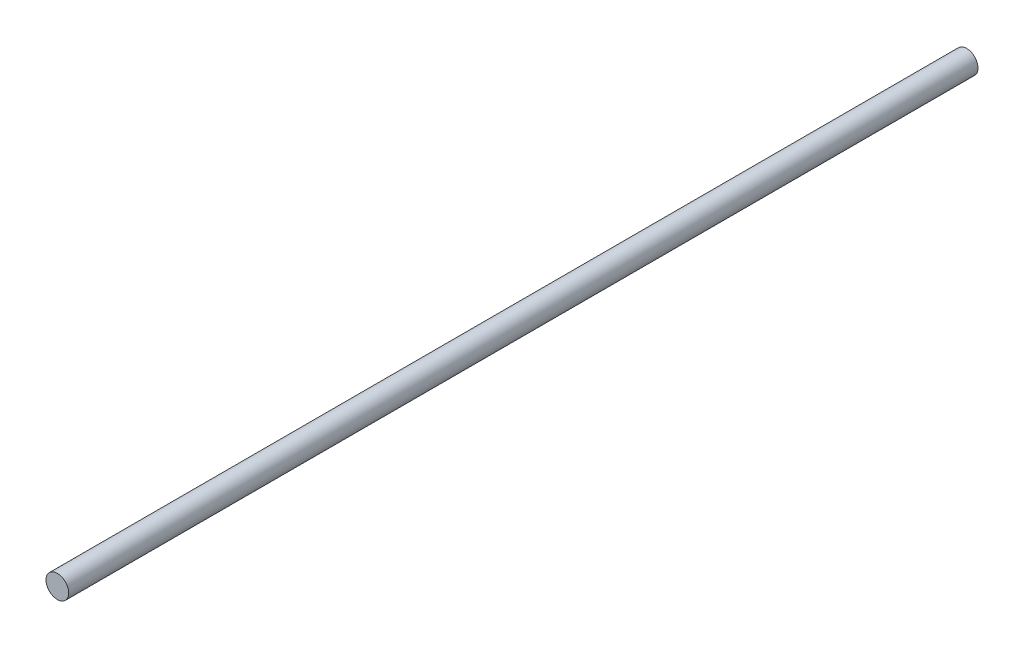
ISO-10303-21;
HEADER;
FILE_DESCRIPTION(('STEP AP214'),'2;1');
FILE_NAME('part.step','',(''),(''),'','','');
FILE_SCHEMA(('AUTOMOTIVE_DESIGN { 1 0 10303 214 1 1 1 1 }'));
ENDSEC;
DATA;
#1=APPLICATION_CONTEXT('core data for automotive mechanical design processes');
#2=APPLICATION_PROTOCOL_DEFINITION('international standard','automotive_design',2000,#1);
#3=PRODUCT_CONTEXT('',#1,'mechanical');
#4=PRODUCT('Part','Part','',(#3));
#5=PRODUCT_RELATED_PRODUCT_CATEGORY('part','',(#4));
#6=PRODUCT_DEFINITION_FORMATION('','',#4);
#7=PRODUCT_DEFINITION_CONTEXT('part definition',#1,'design');
#8=PRODUCT_DEFINITION('design','',#6,#7);
#9=PRODUCT_DEFINITION_SHAPE('','',#8);
#10=(LENGTH_UNIT() NAMED_UNIT(*) SI_UNIT(.MILLI.,.METRE.));
#11=(NAMED_UNIT(*) PLANE_ANGLE_UNIT() SI_UNIT($,.RADIAN.));
#12=(NAMED_UNIT(*) SI_UNIT($,.STERADIAN.) SOLID_ANGLE_UNIT());
#13=UNCERTAINTY_MEASURE_WITH_UNIT(LENGTH_MEASURE(1.E-05),#10,'distance_accuracy_value','');
#14=(GEOMETRIC_REPRESENTATION_CONTEXT(3) GLOBAL_UNCERTAINTY_ASSIGNED_CONTEXT((#13)) GLOBAL_UNIT_ASSIGNED_CONTEXT((#10,
#11,#12)) REPRESENTATION_CONTEXT('',''));
#15=CARTESIAN_POINT('',(0.,0.,0.));
#16=DIRECTION('',(0.,0.,1.));
#17=DIRECTION('',(1.,0.,0.));
#18=AXIS2_PLACEMENT_3D('',#15,#16,#17);
#19=CARTESIAN_POINT('',(0.,0.,254.));
#20=DIRECTION('',(0.,0.,-1.));
#21=DIRECTION('',(-1.,0.,0.));
#22=AXIS2_PLACEMENT_3D('',#19,#20,#21);
#23=CYLINDRICAL_SURFACE('',#22,3.175);
#24=CARTESIAN_POINT('',(0.,0.,254.));
#25=DIRECTION('',(0.,0.,1.));
#26=DIRECTION('',(1.,0.,0.));
#27=AXIS2_PLACEMENT_3D('',#24,#25,#26);
#28=CIRCLE('',#27,3.175);
#29=CARTESIAN_POINT('',(3.175,0.,254.));
#30=VERTEX_POINT('',#29);
#31=EDGE_CURVE('E10',#30,#30,#28,.T.);
#32=ORIENTED_EDGE('',*,*,#31,.F.);
#33=EDGE_LOOP('',(#32));
#34=FACE_BOUND('',#33,.T.);
#35=CARTESIAN_POINT('',(0.,0.,0.));
#36=DIRECTION('',(0.,0.,1.));
#37=DIRECTION('',(1.,0.,0.));
#38=AXIS2_PLACEMENT_3D('',#35,#36,#37);
#39=CIRCLE('',#38,3.175);
#40=CARTESIAN_POINT('',(3.175,0.,0.));
#41=VERTEX_POINT('',#40);
#42=EDGE_CURVE('E40',#41,#41,#39,.T.);
#43=ORIENTED_EDGE('',*,*,#42,.T.);
#44=EDGE_LOOP('',(#43));
#45=FACE_BOUND('',#44,.T.);
#46=ADVANCED_FACE('F37',(#34,#45),#23,.T.);
#47=CARTESIAN_POINT('',(0.,0.,254.));
#48=DIRECTION('',(0.,0.,1.));
#49=DIRECTION('',(1.,0.,0.));
#50=AXIS2_PLACEMENT_3D('',#47,#48,#49);
#51=PLANE('',#50);
#52=ORIENTED_EDGE('',*,*,#31,.T.);
#53=EDGE_LOOP('',(#52));
#54=FACE_BOUND('',#53,.T.);
#55=ADVANCED_FACE('F54',(#54),#51,.T.);
#56=CARTESIAN_POINT('',(0.,0.,0.));
#57=DIRECTION('',(0.,0.,1.));
#58=DIRECTION('',(1.,0.,0.));
#59=AXIS2_PLACEMENT_3D('',#56,#57,#58);
#60=PLANE('',#59);
#61=ORIENTED_EDGE('',*,*,#42,.F.);
#62=EDGE_LOOP('',(#61));
#63=FACE_BOUND('',#62,.T.);
#64=ADVANCED_FACE('F52',(#63),#60,.F.);
#65=CLOSED_SHELL('',(#46,#55,#64));
#66=MANIFOLD_SOLID_BREP('B2',#65);
#67=ADVANCED_BREP_SHAPE_REPRESENTATION('',(#18,#66),#14);
#68=SHAPE_DEFINITION_REPRESENTATION(#9,#67);
ENDSEC;
END-ISO-10303-21;
